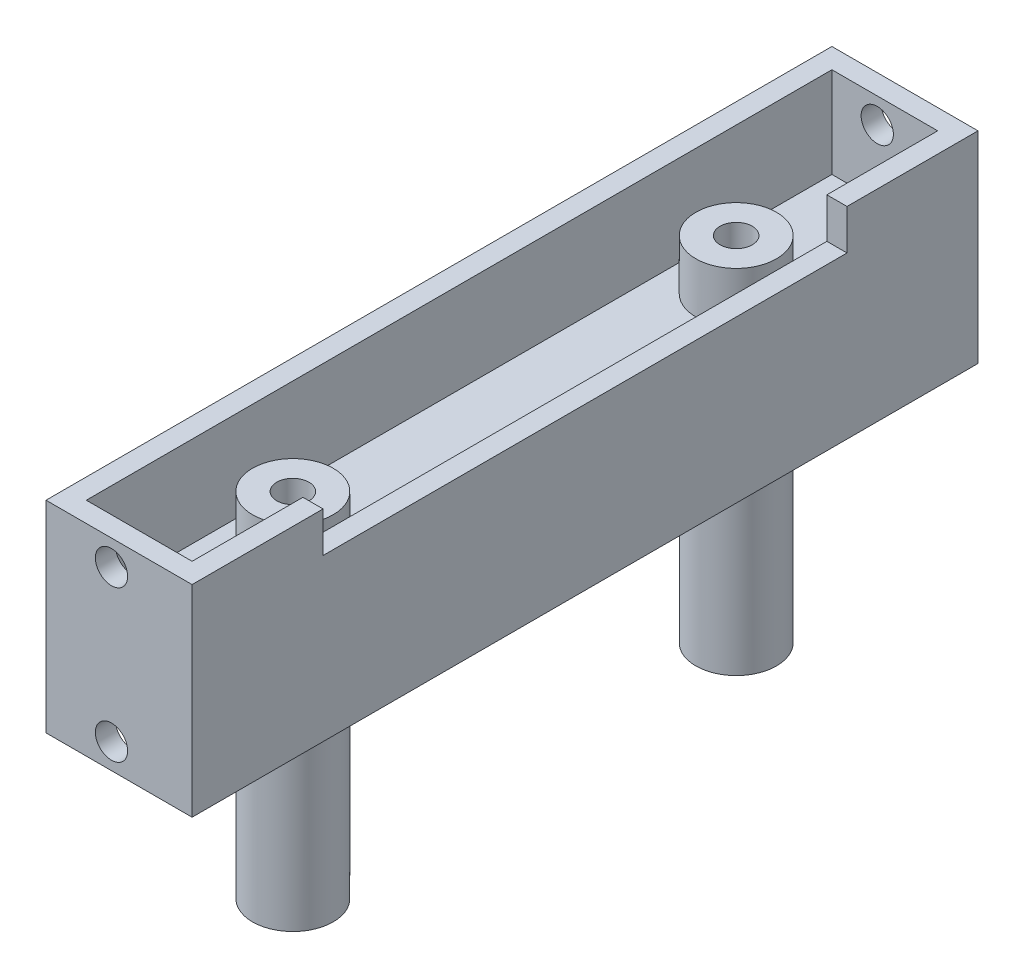
ISO-10303-21;
HEADER;
FILE_DESCRIPTION(('STEP AP214'),'2;1');
FILE_NAME('part.step','',(''),(''),'','','');
FILE_SCHEMA(('AUTOMOTIVE_DESIGN { 1 0 10303 214 1 1 1 1 }'));
ENDSEC;
DATA;
#1=APPLICATION_CONTEXT('core data for automotive mechanical design processes');
#2=APPLICATION_PROTOCOL_DEFINITION('international standard','automotive_design',2000,#1);
#3=PRODUCT_CONTEXT('',#1,'mechanical');
#4=PRODUCT('Part','Part','',(#3));
#5=PRODUCT_RELATED_PRODUCT_CATEGORY('part','',(#4));
#6=PRODUCT_DEFINITION_FORMATION('','',#4);
#7=PRODUCT_DEFINITION_CONTEXT('part definition',#1,'design');
#8=PRODUCT_DEFINITION('design','',#6,#7);
#9=PRODUCT_DEFINITION_SHAPE('','',#8);
#10=(LENGTH_UNIT() NAMED_UNIT(*) SI_UNIT(.MILLI.,.METRE.));
#11=(NAMED_UNIT(*) PLANE_ANGLE_UNIT() SI_UNIT($,.RADIAN.));
#12=(NAMED_UNIT(*) SI_UNIT($,.STERADIAN.) SOLID_ANGLE_UNIT());
#13=UNCERTAINTY_MEASURE_WITH_UNIT(LENGTH_MEASURE(1.E-05),#10,'distance_accuracy_value','');
#14=(GEOMETRIC_REPRESENTATION_CONTEXT(3) GLOBAL_UNCERTAINTY_ASSIGNED_CONTEXT((#13)) GLOBAL_UNIT_ASSIGNED_CONTEXT((#10,
#11,#12)) REPRESENTATION_CONTEXT('',''));
#15=CARTESIAN_POINT('',(0.,0.,0.));
#16=DIRECTION('',(0.,0.,1.));
#17=DIRECTION('',(1.,0.,0.));
#18=AXIS2_PLACEMENT_3D('',#15,#16,#17);
#19=CARTESIAN_POINT('',(-30.,2.,-39.));
#20=DIRECTION('',(0.,0.,1.));
#21=DIRECTION('',(1.,0.,0.));
#22=AXIS2_PLACEMENT_3D('',#19,#20,#21);
#23=PLANE('',#22);
#24=CARTESIAN_POINT('',(-25.5,-6.5,-39.));
#25=DIRECTION('',(0.,0.,1.));
#26=DIRECTION('',(1.,0.,0.));
#27=AXIS2_PLACEMENT_3D('',#24,#25,#26);
#28=CIRCLE('',#27,1.6);
#29=CARTESIAN_POINT('',(-23.9,-6.5,-39.));
#30=VERTEX_POINT('',#29);
#31=EDGE_CURVE('E297',#30,#30,#28,.T.);
#32=ORIENTED_EDGE('',*,*,#31,.T.);
#33=EDGE_LOOP('',(#32));
#34=FACE_BOUND('',#33,.T.);
#35=CARTESIAN_POINT('',(-25.5,8.5,-39.));
#36=DIRECTION('',(0.,0.,1.));
#37=DIRECTION('',(1.,0.,0.));
#38=AXIS2_PLACEMENT_3D('',#35,#36,#37);
#39=CIRCLE('',#38,1.6);
#40=CARTESIAN_POINT('',(-23.9,8.5,-39.));
#41=VERTEX_POINT('',#40);
#42=EDGE_CURVE('E291',#41,#41,#39,.T.);
#43=ORIENTED_EDGE('',*,*,#42,.T.);
#44=EDGE_LOOP('',(#43));
#45=FACE_BOUND('',#44,.T.);
#46=DIRECTION('',(-1.,0.,0.));
#47=VECTOR('',#46,1.);
#48=CARTESIAN_POINT('',(-30.,11.,-39.));
#49=LINE('',#48,#47);
#50=CARTESIAN_POINT('',(-17.5,11.,-39.));
#51=VERTEX_POINT('',#50);
#52=CARTESIAN_POINT('',(-32.,11.,-39.));
#53=VERTEX_POINT('',#52);
#54=EDGE_CURVE('E310',#51,#53,#49,.T.);
#55=ORIENTED_EDGE('',*,*,#54,.F.);
#56=DIRECTION('',(0.,1.,0.));
#57=VECTOR('',#56,1.);
#58=CARTESIAN_POINT('',(-17.5,11.,-39.));
#59=LINE('',#58,#57);
#60=CARTESIAN_POINT('',(-17.5,-8.99999999999999,-39.));
#61=VERTEX_POINT('',#60);
#62=EDGE_CURVE('E203',#61,#51,#59,.T.);
#63=ORIENTED_EDGE('',*,*,#62,.F.);
#64=DIRECTION('',(1.,0.,0.));
#65=VECTOR('',#64,1.);
#66=CARTESIAN_POINT('',(-30.,-9.,-39.));
#67=LINE('',#66,#65);
#68=CARTESIAN_POINT('',(-32.,-9.,-39.));
#69=VERTEX_POINT('',#68);
#70=EDGE_CURVE('E303',#69,#61,#67,.T.);
#71=ORIENTED_EDGE('',*,*,#70,.F.);
#72=DIRECTION('',(0.,-1.,0.));
#73=VECTOR('',#72,1.);
#74=CARTESIAN_POINT('',(-32.,11.,-39.));
#75=LINE('',#74,#73);
#76=EDGE_CURVE('E212',#53,#69,#75,.T.);
#77=ORIENTED_EDGE('',*,*,#76,.F.);
#78=EDGE_LOOP('',(#55,#63,#71,#77));
#79=FACE_BOUND('',#78,.T.);
#80=ADVANCED_FACE('F41',(#34,#45,#79),#23,.F.);
#81=CARTESIAN_POINT('',(0.,2.,0.));
#82=DIRECTION('',(0.,-1.,0.));
#83=DIRECTION('',(0.,0.,-1.));
#84=AXIS2_PLACEMENT_3D('',#81,#82,#83);
#85=PLANE('',#84);
#86=CARTESIAN_POINT('',(-24.5,2.,22.));
#87=DIRECTION('',(0.,-1.,0.));
#88=DIRECTION('',(0.,0.,-1.));
#89=AXIS2_PLACEMENT_3D('',#86,#87,#88);
#90=CIRCLE('',#89,4.);
#91=CARTESIAN_POINT('',(-24.5,2.,18.));
#92=VERTEX_POINT('',#91);
#93=EDGE_CURVE('E279',#92,#92,#90,.F.);
#94=ORIENTED_EDGE('',*,*,#93,.F.);
#95=EDGE_LOOP('',(#94));
#96=FACE_BOUND('',#95,.T.);
#97=CARTESIAN_POINT('',(-24.5,2.,-22.));
#98=DIRECTION('',(0.,-1.,0.));
#99=DIRECTION('',(0.,0.,-1.));
#100=AXIS2_PLACEMENT_3D('',#97,#98,#99);
#101=CIRCLE('',#100,4.);
#102=CARTESIAN_POINT('',(-24.5,2.,-26.));
#103=VERTEX_POINT('',#102);
#104=EDGE_CURVE('E274',#103,#103,#101,.F.);
#105=ORIENTED_EDGE('',*,*,#104,.F.);
#106=EDGE_LOOP('',(#105));
#107=FACE_BOUND('',#106,.T.);
#108=DIRECTION('',(1.,0.,0.));
#109=VECTOR('',#108,1.);
#110=CARTESIAN_POINT('',(0.,2.,37.));
#111=LINE('',#110,#109);
#112=CARTESIAN_POINT('',(-30.,2.,37.));
#113=VERTEX_POINT('',#112);
#114=CARTESIAN_POINT('',(-19.5,2.,37.));
#115=VERTEX_POINT('',#114);
#116=EDGE_CURVE('E329',#113,#115,#111,.T.);
#117=ORIENTED_EDGE('',*,*,#116,.T.);
#118=DIRECTION('',(0.,0.,-1.));
#119=VECTOR('',#118,1.);
#120=CARTESIAN_POINT('',(-19.5,2.,0.));
#121=LINE('',#120,#119);
#122=CARTESIAN_POINT('',(-19.5,2.,-37.));
#123=VERTEX_POINT('',#122);
#124=EDGE_CURVE('E242',#115,#123,#121,.T.);
#125=ORIENTED_EDGE('',*,*,#124,.T.);
#126=DIRECTION('',(-1.,0.,0.));
#127=VECTOR('',#126,1.);
#128=CARTESIAN_POINT('',(0.,2.,-37.));
#129=LINE('',#128,#127);
#130=CARTESIAN_POINT('',(-30.,2.,-37.));
#131=VERTEX_POINT('',#130);
#132=EDGE_CURVE('E312',#123,#131,#129,.T.);
#133=ORIENTED_EDGE('',*,*,#132,.T.);
#134=DIRECTION('',(0.,0.,1.));
#135=VECTOR('',#134,1.);
#136=CARTESIAN_POINT('',(-30.,2.,39.));
#137=LINE('',#136,#135);
#138=EDGE_CURVE('E277',#131,#113,#137,.T.);
#139=ORIENTED_EDGE('',*,*,#138,.T.);
#140=EDGE_LOOP('',(#117,#125,#133,#139));
#141=FACE_BOUND('',#140,.T.);
#142=ADVANCED_FACE('F385',(#96,#107,#141),#85,.F.);
#143=CARTESIAN_POINT('',(0.,0.,0.));
#144=DIRECTION('',(0.,-1.,0.));
#145=DIRECTION('',(0.,0.,-1.));
#146=AXIS2_PLACEMENT_3D('',#143,#144,#145);
#147=PLANE('',#146);
#148=DIRECTION('',(0.,0.,-1.));
#149=VECTOR('',#148,1.);
#150=CARTESIAN_POINT('',(-19.5,0.,0.));
#151=LINE('',#150,#149);
#152=CARTESIAN_POINT('',(-19.5,0.,35.));
#153=VERTEX_POINT('',#152);
#154=CARTESIAN_POINT('',(-19.5,0.,-35.));
#155=VERTEX_POINT('',#154);
#156=EDGE_CURVE('E231',#153,#155,#151,.T.);
#157=ORIENTED_EDGE('',*,*,#156,.F.);
#158=DIRECTION('',(1.,0.,0.));
#159=VECTOR('',#158,1.);
#160=CARTESIAN_POINT('',(-30.,0.,35.));
#161=LINE('',#160,#159);
#162=CARTESIAN_POINT('',(-30.,0.,35.));
#163=VERTEX_POINT('',#162);
#164=EDGE_CURVE('E350',#153,#163,#161,.F.);
#165=ORIENTED_EDGE('',*,*,#164,.T.);
#166=DIRECTION('',(0.,0.,1.));
#167=VECTOR('',#166,1.);
#168=CARTESIAN_POINT('',(-30.,0.,39.));
#169=LINE('',#168,#167);
#170=CARTESIAN_POINT('',(-30.,0.,-35.));
#171=VERTEX_POINT('',#170);
#172=EDGE_CURVE('E331',#171,#163,#169,.T.);
#173=ORIENTED_EDGE('',*,*,#172,.F.);
#174=DIRECTION('',(-1.,0.,0.));
#175=VECTOR('',#174,1.);
#176=CARTESIAN_POINT('',(30.,0.,-35.));
#177=LINE('',#176,#175);
#178=EDGE_CURVE('E349',#171,#155,#177,.F.);
#179=ORIENTED_EDGE('',*,*,#178,.T.);
#180=EDGE_LOOP('',(#157,#165,#173,#179));
#181=FACE_BOUND('',#180,.T.);
#182=CARTESIAN_POINT('',(-24.5,0.,22.));
#183=DIRECTION('',(0.,-1.,0.));
#184=DIRECTION('',(0.,0.,-1.));
#185=AXIS2_PLACEMENT_3D('',#182,#183,#184);
#186=CIRCLE('',#185,4.);
#187=CARTESIAN_POINT('',(-24.5,0.,18.));
#188=VERTEX_POINT('',#187);
#189=EDGE_CURVE('E288',#188,#188,#186,.F.);
#190=ORIENTED_EDGE('',*,*,#189,.T.);
#191=EDGE_LOOP('',(#190));
#192=FACE_BOUND('',#191,.T.);
#193=CARTESIAN_POINT('',(-24.5,0.,-22.));
#194=DIRECTION('',(0.,-1.,0.));
#195=DIRECTION('',(0.,0.,-1.));
#196=AXIS2_PLACEMENT_3D('',#193,#194,#195);
#197=CIRCLE('',#196,4.);
#198=CARTESIAN_POINT('',(-24.5,0.,-26.));
#199=VERTEX_POINT('',#198);
#200=EDGE_CURVE('E271',#199,#199,#197,.F.);
#201=ORIENTED_EDGE('',*,*,#200,.T.);
#202=EDGE_LOOP('',(#201));
#203=FACE_BOUND('',#202,.T.);
#204=ADVANCED_FACE('F421',(#181,#192,#203),#147,.T.);
#205=CARTESIAN_POINT('',(-30.,2.,39.));
#206=DIRECTION('',(0.,0.,-1.));
#207=DIRECTION('',(-1.,0.,0.));
#208=AXIS2_PLACEMENT_3D('',#205,#206,#207);
#209=PLANE('',#208);
#210=CARTESIAN_POINT('',(-25.5,-6.5,39.));
#211=DIRECTION('',(0.,0.,1.));
#212=DIRECTION('',(-1.,0.,0.));
#213=AXIS2_PLACEMENT_3D('',#210,#211,#212);
#214=CIRCLE('',#213,1.6);
#215=CARTESIAN_POINT('',(-27.1,-6.5,39.));
#216=VERTEX_POINT('',#215);
#217=EDGE_CURVE('E282',#216,#216,#214,.T.);
#218=ORIENTED_EDGE('',*,*,#217,.F.);
#219=EDGE_LOOP('',(#218));
#220=FACE_BOUND('',#219,.T.);
#221=CARTESIAN_POINT('',(-25.5,8.5,39.));
#222=DIRECTION('',(0.,0.,1.));
#223=DIRECTION('',(1.,0.,0.));
#224=AXIS2_PLACEMENT_3D('',#221,#222,#223);
#225=CIRCLE('',#224,1.6);
#226=CARTESIAN_POINT('',(-23.9,8.5,39.));
#227=VERTEX_POINT('',#226);
#228=EDGE_CURVE('E285',#227,#227,#225,.T.);
#229=ORIENTED_EDGE('',*,*,#228,.F.);
#230=EDGE_LOOP('',(#229));
#231=FACE_BOUND('',#230,.T.);
#232=DIRECTION('',(1.,0.,0.));
#233=VECTOR('',#232,1.);
#234=CARTESIAN_POINT('',(-30.,-9.,39.));
#235=LINE('',#234,#233);
#236=CARTESIAN_POINT('',(-32.,-9.,39.));
#237=VERTEX_POINT('',#236);
#238=CARTESIAN_POINT('',(-17.5,-8.99999999999999,39.));
#239=VERTEX_POINT('',#238);
#240=EDGE_CURVE('E323',#237,#239,#235,.T.);
#241=ORIENTED_EDGE('',*,*,#240,.T.);
#242=DIRECTION('',(0.,-1.,0.));
#243=VECTOR('',#242,1.);
#244=CARTESIAN_POINT('',(-17.5,11.,39.));
#245=LINE('',#244,#243);
#246=CARTESIAN_POINT('',(-17.5,11.,39.));
#247=VERTEX_POINT('',#246);
#248=EDGE_CURVE('E195',#247,#239,#245,.T.);
#249=ORIENTED_EDGE('',*,*,#248,.F.);
#250=DIRECTION('',(-1.,0.,0.));
#251=VECTOR('',#250,1.);
#252=CARTESIAN_POINT('',(-30.,11.,39.));
#253=LINE('',#252,#251);
#254=CARTESIAN_POINT('',(-32.,11.,39.));
#255=VERTEX_POINT('',#254);
#256=EDGE_CURVE('E320',#247,#255,#253,.T.);
#257=ORIENTED_EDGE('',*,*,#256,.T.);
#258=DIRECTION('',(0.,1.,0.));
#259=VECTOR('',#258,1.);
#260=CARTESIAN_POINT('',(-32.,11.,39.));
#261=LINE('',#260,#259);
#262=EDGE_CURVE('E220',#237,#255,#261,.T.);
#263=ORIENTED_EDGE('',*,*,#262,.F.);
#264=EDGE_LOOP('',(#241,#249,#257,#263));
#265=FACE_BOUND('',#264,.T.);
#266=ADVANCED_FACE('F395',(#220,#231,#265),#209,.F.);
#267=CARTESIAN_POINT('',(0.,0.,37.));
#268=DIRECTION('',(0.,0.,-1.));
#269=DIRECTION('',(-1.,0.,0.));
#270=AXIS2_PLACEMENT_3D('',#267,#268,#269);
#271=PLANE('',#270);
#272=DIRECTION('',(0.,1.,0.));
#273=VECTOR('',#272,1.);
#274=CARTESIAN_POINT('',(-19.5,0.,37.));
#275=LINE('',#274,#273);
#276=CARTESIAN_POINT('',(-19.5,-9.,37.));
#277=VERTEX_POINT('',#276);
#278=CARTESIAN_POINT('',(-19.5,-2.,37.));
#279=VERTEX_POINT('',#278);
#280=EDGE_CURVE('E238',#277,#279,#275,.T.);
#281=ORIENTED_EDGE('',*,*,#280,.F.);
#282=DIRECTION('',(1.,0.,0.));
#283=VECTOR('',#282,1.);
#284=CARTESIAN_POINT('',(-30.,-9.,37.));
#285=LINE('',#284,#283);
#286=CARTESIAN_POINT('',(-30.,-9.,37.));
#287=VERTEX_POINT('',#286);
#288=EDGE_CURVE('E321',#287,#277,#285,.T.);
#289=ORIENTED_EDGE('',*,*,#288,.F.);
#290=DIRECTION('',(0.,-1.,0.));
#291=VECTOR('',#290,1.);
#292=CARTESIAN_POINT('',(-30.,-9.,37.));
#293=LINE('',#292,#291);
#294=CARTESIAN_POINT('',(-30.,-2.,37.));
#295=VERTEX_POINT('',#294);
#296=EDGE_CURVE('E318',#295,#287,#293,.T.);
#297=ORIENTED_EDGE('',*,*,#296,.F.);
#298=DIRECTION('',(1.,0.,0.));
#299=VECTOR('',#298,1.);
#300=CARTESIAN_POINT('',(30.,-2.,37.));
#301=LINE('',#300,#299);
#302=EDGE_CURVE('E281',#295,#279,#301,.T.);
#303=ORIENTED_EDGE('',*,*,#302,.T.);
#304=EDGE_LOOP('',(#281,#289,#297,#303));
#305=FACE_BOUND('',#304,.T.);
#306=CARTESIAN_POINT('',(-25.5,-6.5,37.));
#307=DIRECTION('',(0.,0.,-1.));
#308=DIRECTION('',(-1.,0.,0.));
#309=AXIS2_PLACEMENT_3D('',#306,#307,#308);
#310=CIRCLE('',#309,1.6);
#311=CARTESIAN_POINT('',(-27.1,-6.5,37.));
#312=VERTEX_POINT('',#311);
#313=EDGE_CURVE('E300',#312,#312,#310,.T.);
#314=ORIENTED_EDGE('',*,*,#313,.F.);
#315=EDGE_LOOP('',(#314));
#316=FACE_BOUND('',#315,.T.);
#317=ADVANCED_FACE('F446',(#305,#316),#271,.T.);
#318=DIRECTION('',(0.,1.,0.));
#319=VECTOR('',#318,1.);
#320=CARTESIAN_POINT('',(-19.5,0.,37.));
#321=LINE('',#320,#319);
#322=CARTESIAN_POINT('',(-19.5,11.,37.));
#323=VERTEX_POINT('',#322);
#324=EDGE_CURVE('E246',#115,#323,#321,.T.);
#325=ORIENTED_EDGE('',*,*,#324,.F.);
#326=ORIENTED_EDGE('',*,*,#116,.F.);
#327=CARTESIAN_POINT('',(-30.,11.,37.));
#328=VERTEX_POINT('',#327);
#329=EDGE_CURVE('E324',#328,#113,#293,.T.);
#330=ORIENTED_EDGE('',*,*,#329,.F.);
#331=DIRECTION('',(-1.,0.,0.));
#332=VECTOR('',#331,1.);
#333=CARTESIAN_POINT('',(-30.,11.,37.));
#334=LINE('',#333,#332);
#335=EDGE_CURVE('E319',#323,#328,#334,.T.);
#336=ORIENTED_EDGE('',*,*,#335,.F.);
#337=EDGE_LOOP('',(#325,#326,#330,#336));
#338=FACE_BOUND('',#337,.T.);
#339=CARTESIAN_POINT('',(-25.5,8.5,37.));
#340=DIRECTION('',(0.,0.,-1.));
#341=DIRECTION('',(-1.,0.,0.));
#342=AXIS2_PLACEMENT_3D('',#339,#340,#341);
#343=CIRCLE('',#342,1.6);
#344=CARTESIAN_POINT('',(-27.1,8.5,37.));
#345=VERTEX_POINT('',#344);
#346=EDGE_CURVE('E287',#345,#345,#343,.T.);
#347=ORIENTED_EDGE('',*,*,#346,.F.);
#348=EDGE_LOOP('',(#347));
#349=FACE_BOUND('',#348,.T.);
#350=ADVANCED_FACE('F383',(#338,#349),#271,.T.);
#351=CARTESIAN_POINT('',(-30.,11.,37.));
#352=DIRECTION('',(0.,1.,0.));
#353=DIRECTION('',(0.,0.,1.));
#354=AXIS2_PLACEMENT_3D('',#351,#352,#353);
#355=PLANE('',#354);
#356=DIRECTION('',(1.,0.,0.));
#357=VECTOR('',#356,1.);
#358=CARTESIAN_POINT('',(-10.5,11.,26.));
#359=LINE('',#358,#357);
#360=CARTESIAN_POINT('',(-19.5,11.,26.));
#361=VERTEX_POINT('',#360);
#362=CARTESIAN_POINT('',(-17.5,11.,26.));
#363=VERTEX_POINT('',#362);
#364=EDGE_CURVE('E362',#361,#363,#359,.T.);
#365=ORIENTED_EDGE('',*,*,#364,.F.);
#366=DIRECTION('',(0.,0.,1.));
#367=VECTOR('',#366,1.);
#368=CARTESIAN_POINT('',(-19.5,11.,39.));
#369=LINE('',#368,#367);
#370=EDGE_CURVE('E213',#361,#323,#369,.T.);
#371=ORIENTED_EDGE('',*,*,#370,.T.);
#372=ORIENTED_EDGE('',*,*,#335,.T.);
#373=DIRECTION('',(0.,0.,-1.));
#374=VECTOR('',#373,1.);
#375=CARTESIAN_POINT('',(-30.,11.,-39.));
#376=LINE('',#375,#374);
#377=CARTESIAN_POINT('',(-30.,11.,-37.));
#378=VERTEX_POINT('',#377);
#379=EDGE_CURVE('E217',#328,#378,#376,.T.);
#380=ORIENTED_EDGE('',*,*,#379,.T.);
#381=DIRECTION('',(-1.,0.,0.));
#382=VECTOR('',#381,1.);
#383=CARTESIAN_POINT('',(-30.,11.,-37.));
#384=LINE('',#383,#382);
#385=CARTESIAN_POINT('',(-19.5,11.,-37.));
#386=VERTEX_POINT('',#385);
#387=EDGE_CURVE('E311',#386,#378,#384,.T.);
#388=ORIENTED_EDGE('',*,*,#387,.F.);
#389=CARTESIAN_POINT('',(-19.5,11.,-26.));
#390=VERTEX_POINT('',#389);
#391=EDGE_CURVE('E199',#386,#390,#369,.T.);
#392=ORIENTED_EDGE('',*,*,#391,.T.);
#393=DIRECTION('',(-1.,0.,0.));
#394=VECTOR('',#393,1.);
#395=CARTESIAN_POINT('',(-10.5,11.,-26.));
#396=LINE('',#395,#394);
#397=CARTESIAN_POINT('',(-17.5,11.,-26.));
#398=VERTEX_POINT('',#397);
#399=EDGE_CURVE('E173',#398,#390,#396,.T.);
#400=ORIENTED_EDGE('',*,*,#399,.F.);
#401=DIRECTION('',(0.,0.,1.));
#402=VECTOR('',#401,1.);
#403=CARTESIAN_POINT('',(-17.5,11.,39.));
#404=LINE('',#403,#402);
#405=EDGE_CURVE('E202',#51,#398,#404,.T.);
#406=ORIENTED_EDGE('',*,*,#405,.F.);
#407=ORIENTED_EDGE('',*,*,#54,.T.);
#408=DIRECTION('',(0.,0.,-1.));
#409=VECTOR('',#408,1.);
#410=CARTESIAN_POINT('',(-32.,11.,-39.));
#411=LINE('',#410,#409);
#412=EDGE_CURVE('E221',#255,#53,#411,.T.);
#413=ORIENTED_EDGE('',*,*,#412,.F.);
#414=ORIENTED_EDGE('',*,*,#256,.F.);
#415=EDGE_CURVE('E204',#363,#247,#404,.T.);
#416=ORIENTED_EDGE('',*,*,#415,.F.);
#417=EDGE_LOOP('',(#365,#371,#372,#380,#388,#392,#400,#406,#407,#413,#414,#416));
#418=FACE_BOUND('',#417,.T.);
#419=ADVANCED_FACE('F371',(#418),#355,.T.);
#420=CARTESIAN_POINT('',(-30.,-9.,-37.));
#421=DIRECTION('',(0.,1.,0.));
#422=DIRECTION('',(0.,0.,1.));
#423=AXIS2_PLACEMENT_3D('',#420,#421,#422);
#424=PLANE('',#423);
#425=ORIENTED_EDGE('',*,*,#288,.T.);
#426=DIRECTION('',(0.,0.,-1.));
#427=VECTOR('',#426,1.);
#428=CARTESIAN_POINT('',(-19.5,-8.99999999999999,39.));
#429=LINE('',#428,#427);
#430=CARTESIAN_POINT('',(-19.5,-9.,-37.));
#431=VERTEX_POINT('',#430);
#432=EDGE_CURVE('E178',#277,#431,#429,.T.);
#433=ORIENTED_EDGE('',*,*,#432,.T.);
#434=DIRECTION('',(1.,0.,0.));
#435=VECTOR('',#434,1.);
#436=CARTESIAN_POINT('',(-30.,-9.,-37.));
#437=LINE('',#436,#435);
#438=CARTESIAN_POINT('',(-30.,-9.,-37.));
#439=VERTEX_POINT('',#438);
#440=EDGE_CURVE('E302',#439,#431,#437,.T.);
#441=ORIENTED_EDGE('',*,*,#440,.F.);
#442=DIRECTION('',(0.,0.,1.));
#443=VECTOR('',#442,1.);
#444=CARTESIAN_POINT('',(-30.,-9.,-39.));
#445=LINE('',#444,#443);
#446=EDGE_CURVE('E206',#439,#287,#445,.T.);
#447=ORIENTED_EDGE('',*,*,#446,.T.);
#448=EDGE_LOOP('',(#425,#433,#441,#447));
#449=FACE_BOUND('',#448,.T.);
#450=ORIENTED_EDGE('',*,*,#70,.T.);
#451=DIRECTION('',(0.,0.,-1.));
#452=VECTOR('',#451,1.);
#453=CARTESIAN_POINT('',(-17.5,-8.99999999999999,39.));
#454=LINE('',#453,#452);
#455=EDGE_CURVE('E197',#239,#61,#454,.T.);
#456=ORIENTED_EDGE('',*,*,#455,.F.);
#457=ORIENTED_EDGE('',*,*,#240,.F.);
#458=DIRECTION('',(0.,0.,1.));
#459=VECTOR('',#458,1.);
#460=CARTESIAN_POINT('',(-32.,-9.,-39.));
#461=LINE('',#460,#459);
#462=EDGE_CURVE('E216',#69,#237,#461,.T.);
#463=ORIENTED_EDGE('',*,*,#462,.F.);
#464=EDGE_LOOP('',(#450,#456,#457,#463));
#465=FACE_BOUND('',#464,.T.);
#466=ADVANCED_FACE('F399',(#449,#465),#424,.F.);
#467=CARTESIAN_POINT('',(0.,0.,-37.));
#468=DIRECTION('',(0.,0.,1.));
#469=DIRECTION('',(-1.,0.,0.));
#470=AXIS2_PLACEMENT_3D('',#467,#468,#469);
#471=PLANE('',#470);
#472=DIRECTION('',(0.,-1.,0.));
#473=VECTOR('',#472,1.);
#474=CARTESIAN_POINT('',(-19.5,0.,-37.));
#475=LINE('',#474,#473);
#476=CARTESIAN_POINT('',(-19.5,-2.,-37.));
#477=VERTEX_POINT('',#476);
#478=EDGE_CURVE('E228',#477,#431,#475,.T.);
#479=ORIENTED_EDGE('',*,*,#478,.F.);
#480=DIRECTION('',(-1.,0.,0.));
#481=VECTOR('',#480,1.);
#482=CARTESIAN_POINT('',(-30.,-2.,-37.));
#483=LINE('',#482,#481);
#484=CARTESIAN_POINT('',(-30.,-2.,-37.));
#485=VERTEX_POINT('',#484);
#486=EDGE_CURVE('E355',#477,#485,#483,.T.);
#487=ORIENTED_EDGE('',*,*,#486,.T.);
#488=DIRECTION('',(0.,-1.,0.));
#489=VECTOR('',#488,1.);
#490=CARTESIAN_POINT('',(-30.,-9.,-37.));
#491=LINE('',#490,#489);
#492=EDGE_CURVE('E306',#485,#439,#491,.T.);
#493=ORIENTED_EDGE('',*,*,#492,.T.);
#494=ORIENTED_EDGE('',*,*,#440,.T.);
#495=EDGE_LOOP('',(#479,#487,#493,#494));
#496=FACE_BOUND('',#495,.T.);
#497=CARTESIAN_POINT('',(-25.5,-6.5,-37.));
#498=DIRECTION('',(0.,0.,1.));
#499=DIRECTION('',(1.,0.,0.));
#500=AXIS2_PLACEMENT_3D('',#497,#498,#499);
#501=CIRCLE('',#500,1.6);
#502=CARTESIAN_POINT('',(-23.9,-6.5,-37.));
#503=VERTEX_POINT('',#502);
#504=EDGE_CURVE('E298',#503,#503,#501,.T.);
#505=ORIENTED_EDGE('',*,*,#504,.F.);
#506=EDGE_LOOP('',(#505));
#507=FACE_BOUND('',#506,.T.);
#508=ADVANCED_FACE('F458',(#496,#507),#471,.T.);
#509=DIRECTION('',(0.,-1.,0.));
#510=VECTOR('',#509,1.);
#511=CARTESIAN_POINT('',(-19.5,0.,-37.));
#512=LINE('',#511,#510);
#513=EDGE_CURVE('E241',#386,#123,#512,.T.);
#514=ORIENTED_EDGE('',*,*,#513,.F.);
#515=ORIENTED_EDGE('',*,*,#387,.T.);
#516=EDGE_CURVE('E308',#378,#131,#491,.T.);
#517=ORIENTED_EDGE('',*,*,#516,.T.);
#518=ORIENTED_EDGE('',*,*,#132,.F.);
#519=EDGE_LOOP('',(#514,#515,#517,#518));
#520=FACE_BOUND('',#519,.T.);
#521=CARTESIAN_POINT('',(-25.5,8.5,-37.));
#522=DIRECTION('',(0.,0.,1.));
#523=DIRECTION('',(1.,0.,0.));
#524=AXIS2_PLACEMENT_3D('',#521,#522,#523);
#525=CIRCLE('',#524,1.6);
#526=CARTESIAN_POINT('',(-23.9,8.5,-37.));
#527=VERTEX_POINT('',#526);
#528=EDGE_CURVE('E289',#527,#527,#525,.T.);
#529=ORIENTED_EDGE('',*,*,#528,.F.);
#530=EDGE_LOOP('',(#529));
#531=FACE_BOUND('',#530,.T.);
#532=ADVANCED_FACE('F380',(#520,#531),#471,.T.);
#533=CARTESIAN_POINT('',(-25.5,8.5,-87.));
#534=DIRECTION('',(0.,0.,1.));
#535=DIRECTION('',(1.,0.,0.));
#536=AXIS2_PLACEMENT_3D('',#533,#534,#535);
#537=CYLINDRICAL_SURFACE('',#536,1.6);
#538=ORIENTED_EDGE('',*,*,#528,.T.);
#539=EDGE_LOOP('',(#538));
#540=FACE_BOUND('',#539,.T.);
#541=ORIENTED_EDGE('',*,*,#42,.F.);
#542=EDGE_LOOP('',(#541));
#543=FACE_BOUND('',#542,.T.);
#544=ADVANCED_FACE('F469',(#540,#543),#537,.F.);
#545=CARTESIAN_POINT('',(-25.5,-6.5,-87.));
#546=DIRECTION('',(0.,0.,1.));
#547=DIRECTION('',(1.,0.,0.));
#548=AXIS2_PLACEMENT_3D('',#545,#546,#547);
#549=CYLINDRICAL_SURFACE('',#548,1.6);
#550=ORIENTED_EDGE('',*,*,#504,.T.);
#551=EDGE_LOOP('',(#550));
#552=FACE_BOUND('',#551,.T.);
#553=ORIENTED_EDGE('',*,*,#31,.F.);
#554=EDGE_LOOP('',(#553));
#555=FACE_BOUND('',#554,.T.);
#556=ADVANCED_FACE('F462',(#552,#555),#549,.F.);
#557=ORIENTED_EDGE('',*,*,#346,.T.);
#558=EDGE_LOOP('',(#557));
#559=FACE_BOUND('',#558,.T.);
#560=ORIENTED_EDGE('',*,*,#228,.T.);
#561=EDGE_LOOP('',(#560));
#562=FACE_BOUND('',#561,.T.);
#563=ADVANCED_FACE('F466',(#559,#562),#537,.F.);
#564=ORIENTED_EDGE('',*,*,#313,.T.);
#565=EDGE_LOOP('',(#564));
#566=FACE_BOUND('',#565,.T.);
#567=ORIENTED_EDGE('',*,*,#217,.T.);
#568=EDGE_LOOP('',(#567));
#569=FACE_BOUND('',#568,.T.);
#570=ADVANCED_FACE('F473',(#566,#569),#549,.F.);
#571=CARTESIAN_POINT('',(-24.5,7.,-22.));
#572=DIRECTION('',(0.,-1.,0.));
#573=DIRECTION('',(0.,0.,-1.));
#574=AXIS2_PLACEMENT_3D('',#571,#572,#573);
#575=CYLINDRICAL_SURFACE('',#574,4.);
#576=ORIENTED_EDGE('',*,*,#200,.F.);
#577=EDGE_LOOP('',(#576));
#578=FACE_BOUND('',#577,.T.);
#579=CARTESIAN_POINT('',(-24.5,-28.,-22.));
#580=DIRECTION('',(0.,1.,0.));
#581=DIRECTION('',(0.,0.,1.));
#582=AXIS2_PLACEMENT_3D('',#579,#580,#581);
#583=CIRCLE('',#582,4.);
#584=CARTESIAN_POINT('',(-24.5,-28.,-18.));
#585=VERTEX_POINT('',#584);
#586=EDGE_CURVE('E263',#585,#585,#583,.T.);
#587=ORIENTED_EDGE('',*,*,#586,.T.);
#588=EDGE_LOOP('',(#587));
#589=FACE_BOUND('',#588,.T.);
#590=ADVANCED_FACE('F485',(#578,#589),#575,.T.);
#591=CARTESIAN_POINT('',(-24.5,-28.,-22.));
#592=DIRECTION('',(0.,1.,0.));
#593=DIRECTION('',(0.,0.,1.));
#594=AXIS2_PLACEMENT_3D('',#591,#592,#593);
#595=PLANE('',#594);
#596=CARTESIAN_POINT('',(-24.5,-28.,-22.));
#597=DIRECTION('',(0.,1.,0.));
#598=DIRECTION('',(0.,0.,1.));
#599=AXIS2_PLACEMENT_3D('',#596,#597,#598);
#600=CIRCLE('',#599,1.6);
#601=CARTESIAN_POINT('',(-24.5,-28.,-20.4));
#602=VERTEX_POINT('',#601);
#603=EDGE_CURVE('E261',#602,#602,#600,.T.);
#604=ORIENTED_EDGE('',*,*,#603,.T.);
#605=EDGE_LOOP('',(#604));
#606=FACE_BOUND('',#605,.T.);
#607=ORIENTED_EDGE('',*,*,#586,.F.);
#608=EDGE_LOOP('',(#607));
#609=FACE_BOUND('',#608,.T.);
#610=ADVANCED_FACE('F487',(#606,#609),#595,.F.);
#611=CARTESIAN_POINT('',(-24.5,7.,22.));
#612=DIRECTION('',(0.,-1.,0.));
#613=DIRECTION('',(0.,0.,-1.));
#614=AXIS2_PLACEMENT_3D('',#611,#612,#613);
#615=CYLINDRICAL_SURFACE('',#614,4.);
#616=ORIENTED_EDGE('',*,*,#189,.F.);
#617=EDGE_LOOP('',(#616));
#618=FACE_BOUND('',#617,.T.);
#619=CARTESIAN_POINT('',(-24.5,-28.,22.));
#620=DIRECTION('',(0.,1.,0.));
#621=DIRECTION('',(0.,0.,1.));
#622=AXIS2_PLACEMENT_3D('',#619,#620,#621);
#623=CIRCLE('',#622,4.);
#624=CARTESIAN_POINT('',(-24.5,-28.,26.));
#625=VERTEX_POINT('',#624);
#626=EDGE_CURVE('E253',#625,#625,#623,.T.);
#627=ORIENTED_EDGE('',*,*,#626,.T.);
#628=EDGE_LOOP('',(#627));
#629=FACE_BOUND('',#628,.T.);
#630=ADVANCED_FACE('F580',(#618,#629),#615,.T.);
#631=CARTESIAN_POINT('',(-24.5,-28.,22.));
#632=DIRECTION('',(0.,1.,0.));
#633=DIRECTION('',(0.,0.,1.));
#634=AXIS2_PLACEMENT_3D('',#631,#632,#633);
#635=PLANE('',#634);
#636=CARTESIAN_POINT('',(-24.5,-28.,22.));
#637=DIRECTION('',(0.,1.,0.));
#638=DIRECTION('',(0.,0.,1.));
#639=AXIS2_PLACEMENT_3D('',#636,#637,#638);
#640=CIRCLE('',#639,1.6);
#641=CARTESIAN_POINT('',(-24.5,-28.,23.6));
#642=VERTEX_POINT('',#641);
#643=EDGE_CURVE('E257',#642,#642,#640,.T.);
#644=ORIENTED_EDGE('',*,*,#643,.T.);
#645=EDGE_LOOP('',(#644));
#646=FACE_BOUND('',#645,.T.);
#647=ORIENTED_EDGE('',*,*,#626,.F.);
#648=EDGE_LOOP('',(#647));
#649=FACE_BOUND('',#648,.T.);
#650=ADVANCED_FACE('F587',(#646,#649),#635,.F.);
#651=CARTESIAN_POINT('',(-24.5,7.,-22.));
#652=DIRECTION('',(0.,1.,0.));
#653=DIRECTION('',(0.,0.,1.));
#654=AXIS2_PLACEMENT_3D('',#651,#652,#653);
#655=CIRCLE('',#654,4.);
#656=CARTESIAN_POINT('',(-24.5,7.,-18.));
#657=VERTEX_POINT('',#656);
#658=EDGE_CURVE('E267',#657,#657,#655,.T.);
#659=ORIENTED_EDGE('',*,*,#658,.F.);
#660=EDGE_LOOP('',(#659));
#661=FACE_BOUND('',#660,.T.);
#662=ORIENTED_EDGE('',*,*,#104,.T.);
#663=EDGE_LOOP('',(#662));
#664=FACE_BOUND('',#663,.T.);
#665=ADVANCED_FACE('F490',(#661,#664),#575,.T.);
#666=CARTESIAN_POINT('',(-24.5,7.,-22.));
#667=DIRECTION('',(0.,1.,0.));
#668=DIRECTION('',(0.,0.,1.));
#669=AXIS2_PLACEMENT_3D('',#666,#667,#668);
#670=PLANE('',#669);
#671=CARTESIAN_POINT('',(-24.5,7.,-22.));
#672=DIRECTION('',(0.,1.,0.));
#673=DIRECTION('',(0.,0.,1.));
#674=AXIS2_PLACEMENT_3D('',#671,#672,#673);
#675=CIRCLE('',#674,1.6);
#676=CARTESIAN_POINT('',(-24.5,7.,-20.4));
#677=VERTEX_POINT('',#676);
#678=EDGE_CURVE('E270',#677,#677,#675,.T.);
#679=ORIENTED_EDGE('',*,*,#678,.F.);
#680=EDGE_LOOP('',(#679));
#681=FACE_BOUND('',#680,.T.);
#682=ORIENTED_EDGE('',*,*,#658,.T.);
#683=EDGE_LOOP('',(#682));
#684=FACE_BOUND('',#683,.T.);
#685=ADVANCED_FACE('F607',(#681,#684),#670,.T.);
#686=CARTESIAN_POINT('',(-24.5,7.,22.));
#687=DIRECTION('',(0.,1.,0.));
#688=DIRECTION('',(0.,0.,1.));
#689=AXIS2_PLACEMENT_3D('',#686,#687,#688);
#690=CIRCLE('',#689,4.);
#691=CARTESIAN_POINT('',(-24.5,7.,26.));
#692=VERTEX_POINT('',#691);
#693=EDGE_CURVE('E248',#692,#692,#690,.T.);
#694=ORIENTED_EDGE('',*,*,#693,.F.);
#695=EDGE_LOOP('',(#694));
#696=FACE_BOUND('',#695,.T.);
#697=ORIENTED_EDGE('',*,*,#93,.T.);
#698=EDGE_LOOP('',(#697));
#699=FACE_BOUND('',#698,.T.);
#700=ADVANCED_FACE('F590',(#696,#699),#615,.T.);
#701=CARTESIAN_POINT('',(-24.5,7.,22.));
#702=DIRECTION('',(0.,1.,0.));
#703=DIRECTION('',(0.,0.,1.));
#704=AXIS2_PLACEMENT_3D('',#701,#702,#703);
#705=PLANE('',#704);
#706=CARTESIAN_POINT('',(-24.5,7.,22.));
#707=DIRECTION('',(0.,1.,0.));
#708=DIRECTION('',(0.,0.,1.));
#709=AXIS2_PLACEMENT_3D('',#706,#707,#708);
#710=CIRCLE('',#709,1.6);
#711=CARTESIAN_POINT('',(-24.5,7.,23.6));
#712=VERTEX_POINT('',#711);
#713=EDGE_CURVE('E255',#712,#712,#710,.T.);
#714=ORIENTED_EDGE('',*,*,#713,.F.);
#715=EDGE_LOOP('',(#714));
#716=FACE_BOUND('',#715,.T.);
#717=ORIENTED_EDGE('',*,*,#693,.T.);
#718=EDGE_LOOP('',(#717));
#719=FACE_BOUND('',#718,.T.);
#720=ADVANCED_FACE('F510',(#716,#719),#705,.T.);
#721=CARTESIAN_POINT('',(-24.5,-10.,-22.));
#722=DIRECTION('',(0.,1.,0.));
#723=DIRECTION('',(0.,0.,1.));
#724=AXIS2_PLACEMENT_3D('',#721,#722,#723);
#725=CYLINDRICAL_SURFACE('',#724,1.6);
#726=ORIENTED_EDGE('',*,*,#603,.F.);
#727=EDGE_LOOP('',(#726));
#728=FACE_BOUND('',#727,.T.);
#729=ORIENTED_EDGE('',*,*,#678,.T.);
#730=EDGE_LOOP('',(#729));
#731=FACE_BOUND('',#730,.T.);
#732=ADVANCED_FACE('F438',(#728,#731),#725,.F.);
#733=CARTESIAN_POINT('',(-24.5,-10.,22.));
#734=DIRECTION('',(0.,1.,0.));
#735=DIRECTION('',(0.,0.,1.));
#736=AXIS2_PLACEMENT_3D('',#733,#734,#735);
#737=CYLINDRICAL_SURFACE('',#736,1.6);
#738=ORIENTED_EDGE('',*,*,#643,.F.);
#739=EDGE_LOOP('',(#738));
#740=FACE_BOUND('',#739,.T.);
#741=ORIENTED_EDGE('',*,*,#713,.T.);
#742=EDGE_LOOP('',(#741));
#743=FACE_BOUND('',#742,.T.);
#744=ADVANCED_FACE('F431',(#740,#743),#737,.F.);
#745=CARTESIAN_POINT('',(0.,-2.,35.));
#746=DIRECTION('',(-1.,0.,0.));
#747=DIRECTION('',(0.,0.,1.));
#748=AXIS2_PLACEMENT_3D('',#745,#746,#747);
#749=CYLINDRICAL_SURFACE('',#748,2.);
#750=ORIENTED_EDGE('',*,*,#164,.F.);
#751=CARTESIAN_POINT('',(-19.5,-2.,35.));
#752=DIRECTION('',(-1.,0.,0.));
#753=DIRECTION('',(0.,0.,1.));
#754=AXIS2_PLACEMENT_3D('',#751,#752,#753);
#755=CIRCLE('',#754,2.);
#756=EDGE_CURVE('E236',#153,#279,#755,.F.);
#757=ORIENTED_EDGE('',*,*,#756,.T.);
#758=ORIENTED_EDGE('',*,*,#302,.F.);
#759=CARTESIAN_POINT('',(-30.,-2.,35.));
#760=DIRECTION('',(1.,0.,0.));
#761=DIRECTION('',(0.,0.,-1.));
#762=AXIS2_PLACEMENT_3D('',#759,#760,#761);
#763=CIRCLE('',#762,2.);
#764=EDGE_CURVE('E354',#163,#295,#763,.T.);
#765=ORIENTED_EDGE('',*,*,#764,.F.);
#766=EDGE_LOOP('',(#750,#757,#758,#765));
#767=FACE_BOUND('',#766,.T.);
#768=ADVANCED_FACE('F429',(#767),#749,.F.);
#769=CARTESIAN_POINT('',(0.,-2.,-35.));
#770=DIRECTION('',(1.,0.,0.));
#771=DIRECTION('',(0.,0.,-1.));
#772=AXIS2_PLACEMENT_3D('',#769,#770,#771);
#773=CYLINDRICAL_SURFACE('',#772,2.);
#774=ORIENTED_EDGE('',*,*,#486,.F.);
#775=CARTESIAN_POINT('',(-19.5,-2.,-35.));
#776=DIRECTION('',(-1.,0.,0.));
#777=DIRECTION('',(0.,0.,1.));
#778=AXIS2_PLACEMENT_3D('',#775,#776,#777);
#779=CIRCLE('',#778,2.);
#780=EDGE_CURVE('E65',#477,#155,#779,.F.);
#781=ORIENTED_EDGE('',*,*,#780,.T.);
#782=ORIENTED_EDGE('',*,*,#178,.F.);
#783=CARTESIAN_POINT('',(-30.,-2.,-35.));
#784=DIRECTION('',(1.,0.,0.));
#785=DIRECTION('',(0.,0.,-1.));
#786=AXIS2_PLACEMENT_3D('',#783,#784,#785);
#787=CIRCLE('',#786,2.);
#788=EDGE_CURVE('E357',#485,#171,#787,.T.);
#789=ORIENTED_EDGE('',*,*,#788,.F.);
#790=EDGE_LOOP('',(#774,#781,#782,#789));
#791=FACE_BOUND('',#790,.T.);
#792=ADVANCED_FACE('F43',(#791),#773,.F.);
#793=CARTESIAN_POINT('',(-30.,0.,0.));
#794=DIRECTION('',(-1.,0.,0.));
#795=DIRECTION('',(0.,0.,1.));
#796=AXIS2_PLACEMENT_3D('',#793,#794,#795);
#797=PLANE('',#796);
#798=ORIENTED_EDGE('',*,*,#492,.F.);
#799=ORIENTED_EDGE('',*,*,#788,.T.);
#800=ORIENTED_EDGE('',*,*,#172,.T.);
#801=ORIENTED_EDGE('',*,*,#764,.T.);
#802=ORIENTED_EDGE('',*,*,#296,.T.);
#803=ORIENTED_EDGE('',*,*,#446,.F.);
#804=EDGE_LOOP('',(#798,#799,#800,#801,#802,#803));
#805=FACE_BOUND('',#804,.T.);
#806=ADVANCED_FACE('F408',(#805),#797,.F.);
#807=CARTESIAN_POINT('',(-32.,0.,0.));
#808=DIRECTION('',(-1.,0.,0.));
#809=DIRECTION('',(0.,0.,1.));
#810=AXIS2_PLACEMENT_3D('',#807,#808,#809);
#811=PLANE('',#810);
#812=ORIENTED_EDGE('',*,*,#76,.T.);
#813=ORIENTED_EDGE('',*,*,#462,.T.);
#814=ORIENTED_EDGE('',*,*,#262,.T.);
#815=ORIENTED_EDGE('',*,*,#412,.T.);
#816=EDGE_LOOP('',(#812,#813,#814,#815));
#817=FACE_BOUND('',#816,.T.);
#818=ADVANCED_FACE('F401',(#817),#811,.T.);
#819=ORIENTED_EDGE('',*,*,#516,.F.);
#820=ORIENTED_EDGE('',*,*,#379,.F.);
#821=ORIENTED_EDGE('',*,*,#329,.T.);
#822=ORIENTED_EDGE('',*,*,#138,.F.);
#823=EDGE_LOOP('',(#819,#820,#821,#822));
#824=FACE_BOUND('',#823,.T.);
#825=ADVANCED_FACE('F403',(#824),#797,.F.);
#826=CARTESIAN_POINT('',(-19.5,0.,0.));
#827=DIRECTION('',(1.,0.,0.));
#828=DIRECTION('',(0.,0.,-1.));
#829=AXIS2_PLACEMENT_3D('',#826,#827,#828);
#830=PLANE('',#829);
#831=ORIENTED_EDGE('',*,*,#432,.F.);
#832=ORIENTED_EDGE('',*,*,#280,.T.);
#833=ORIENTED_EDGE('',*,*,#756,.F.);
#834=ORIENTED_EDGE('',*,*,#156,.T.);
#835=ORIENTED_EDGE('',*,*,#780,.F.);
#836=ORIENTED_EDGE('',*,*,#478,.T.);
#837=EDGE_LOOP('',(#831,#832,#833,#834,#835,#836));
#838=FACE_BOUND('',#837,.T.);
#839=ADVANCED_FACE('F412',(#838),#830,.F.);
#840=DIRECTION('',(0.,0.,1.));
#841=VECTOR('',#840,1.);
#842=CARTESIAN_POINT('',(-19.5,7.,0.));
#843=LINE('',#842,#841);
#844=CARTESIAN_POINT('',(-19.5,7.,-26.));
#845=VERTEX_POINT('',#844);
#846=CARTESIAN_POINT('',(-19.5,7.,26.));
#847=VERTEX_POINT('',#846);
#848=EDGE_CURVE('E185',#845,#847,#843,.T.);
#849=ORIENTED_EDGE('',*,*,#848,.F.);
#850=DIRECTION('',(0.,1.,0.));
#851=VECTOR('',#850,1.);
#852=CARTESIAN_POINT('',(-19.5,0.,-26.));
#853=LINE('',#852,#851);
#854=EDGE_CURVE('E170',#845,#390,#853,.T.);
#855=ORIENTED_EDGE('',*,*,#854,.T.);
#856=ORIENTED_EDGE('',*,*,#391,.F.);
#857=ORIENTED_EDGE('',*,*,#513,.T.);
#858=ORIENTED_EDGE('',*,*,#124,.F.);
#859=ORIENTED_EDGE('',*,*,#324,.T.);
#860=ORIENTED_EDGE('',*,*,#370,.F.);
#861=DIRECTION('',(0.,-1.,0.));
#862=VECTOR('',#861,1.);
#863=CARTESIAN_POINT('',(-19.5,0.,26.));
#864=LINE('',#863,#862);
#865=EDGE_CURVE('E177',#361,#847,#864,.T.);
#866=ORIENTED_EDGE('',*,*,#865,.T.);
#867=EDGE_LOOP('',(#849,#855,#856,#857,#858,#859,#860,#866));
#868=FACE_BOUND('',#867,.T.);
#869=ADVANCED_FACE('F190',(#868),#830,.F.);
#870=CARTESIAN_POINT('',(-17.5,0.,0.));
#871=DIRECTION('',(1.,0.,0.));
#872=DIRECTION('',(0.,0.,-1.));
#873=AXIS2_PLACEMENT_3D('',#870,#871,#872);
#874=PLANE('',#873);
#875=DIRECTION('',(0.,1.,0.));
#876=VECTOR('',#875,1.);
#877=CARTESIAN_POINT('',(-17.5,0.,-26.));
#878=LINE('',#877,#876);
#879=CARTESIAN_POINT('',(-17.5,7.,-26.));
#880=VERTEX_POINT('',#879);
#881=EDGE_CURVE('E11',#880,#398,#878,.T.);
#882=ORIENTED_EDGE('',*,*,#881,.F.);
#883=DIRECTION('',(0.,0.,1.));
#884=VECTOR('',#883,1.);
#885=CARTESIAN_POINT('',(-17.5,7.,0.));
#886=LINE('',#885,#884);
#887=CARTESIAN_POINT('',(-17.5,7.,26.));
#888=VERTEX_POINT('',#887);
#889=EDGE_CURVE('E183',#880,#888,#886,.T.);
#890=ORIENTED_EDGE('',*,*,#889,.T.);
#891=DIRECTION('',(0.,-1.,0.));
#892=VECTOR('',#891,1.);
#893=CARTESIAN_POINT('',(-17.5,0.,26.));
#894=LINE('',#893,#892);
#895=EDGE_CURVE('E47',#363,#888,#894,.T.);
#896=ORIENTED_EDGE('',*,*,#895,.F.);
#897=ORIENTED_EDGE('',*,*,#415,.T.);
#898=ORIENTED_EDGE('',*,*,#248,.T.);
#899=ORIENTED_EDGE('',*,*,#455,.T.);
#900=ORIENTED_EDGE('',*,*,#62,.T.);
#901=ORIENTED_EDGE('',*,*,#405,.T.);
#902=EDGE_LOOP('',(#882,#890,#896,#897,#898,#899,#900,#901));
#903=FACE_BOUND('',#902,.T.);
#904=ADVANCED_FACE('F368',(#903),#874,.T.);
#905=CARTESIAN_POINT('',(-10.5,-46.851648071345,-26.));
#906=DIRECTION('',(0.,0.,-1.));
#907=DIRECTION('',(-1.,0.,0.));
#908=AXIS2_PLACEMENT_3D('',#905,#906,#907);
#909=PLANE('',#908);
#910=DIRECTION('',(1.,0.,0.));
#911=VECTOR('',#910,1.);
#912=CARTESIAN_POINT('',(-10.5,7.,-26.));
#913=LINE('',#912,#911);
#914=EDGE_CURVE('E167',#845,#880,#913,.T.);
#915=ORIENTED_EDGE('',*,*,#914,.T.);
#916=ORIENTED_EDGE('',*,*,#881,.T.);
#917=ORIENTED_EDGE('',*,*,#399,.T.);
#918=ORIENTED_EDGE('',*,*,#854,.F.);
#919=EDGE_LOOP('',(#915,#916,#917,#918));
#920=FACE_BOUND('',#919,.T.);
#921=ADVANCED_FACE('F169',(#920),#909,.F.);
#922=CARTESIAN_POINT('',(-10.5,-46.851648071345,26.));
#923=DIRECTION('',(0.,0.,1.));
#924=DIRECTION('',(1.,0.,0.));
#925=AXIS2_PLACEMENT_3D('',#922,#923,#924);
#926=PLANE('',#925);
#927=ORIENTED_EDGE('',*,*,#364,.T.);
#928=ORIENTED_EDGE('',*,*,#895,.T.);
#929=DIRECTION('',(-1.,0.,0.));
#930=VECTOR('',#929,1.);
#931=CARTESIAN_POINT('',(-10.5,7.,26.));
#932=LINE('',#931,#930);
#933=EDGE_CURVE('E57',#888,#847,#932,.T.);
#934=ORIENTED_EDGE('',*,*,#933,.T.);
#935=ORIENTED_EDGE('',*,*,#865,.F.);
#936=EDGE_LOOP('',(#927,#928,#934,#935));
#937=FACE_BOUND('',#936,.T.);
#938=ADVANCED_FACE('F361',(#937),#926,.F.);
#939=CARTESIAN_POINT('',(-24.5,7.,-22.));
#940=DIRECTION('',(0.,1.,0.));
#941=DIRECTION('',(0.,0.,1.));
#942=AXIS2_PLACEMENT_3D('',#939,#940,#941);
#943=PLANE('',#942);
#944=ORIENTED_EDGE('',*,*,#848,.T.);
#945=ORIENTED_EDGE('',*,*,#933,.F.);
#946=ORIENTED_EDGE('',*,*,#889,.F.);
#947=ORIENTED_EDGE('',*,*,#914,.F.);
#948=EDGE_LOOP('',(#944,#945,#946,#947));
#949=FACE_BOUND('',#948,.T.);
#950=ADVANCED_FACE('F181',(#949),#943,.T.);
#951=CLOSED_SHELL('',(#80,#142,#204,#266,#317,#350,#419,#466,#508,#532,#544,#556,#563,#570,#590,
#610,#630,#650,#665,#685,#700,#720,#732,#744,#768,#792,#806,#818,#825,#839,#869,#904,#921,#938,#950));
#952=MANIFOLD_SOLID_BREP('B2',#951);
#953=ADVANCED_BREP_SHAPE_REPRESENTATION('',(#18,#952),#14);
#954=SHAPE_DEFINITION_REPRESENTATION(#9,#953);
ENDSEC;
END-ISO-10303-21;
